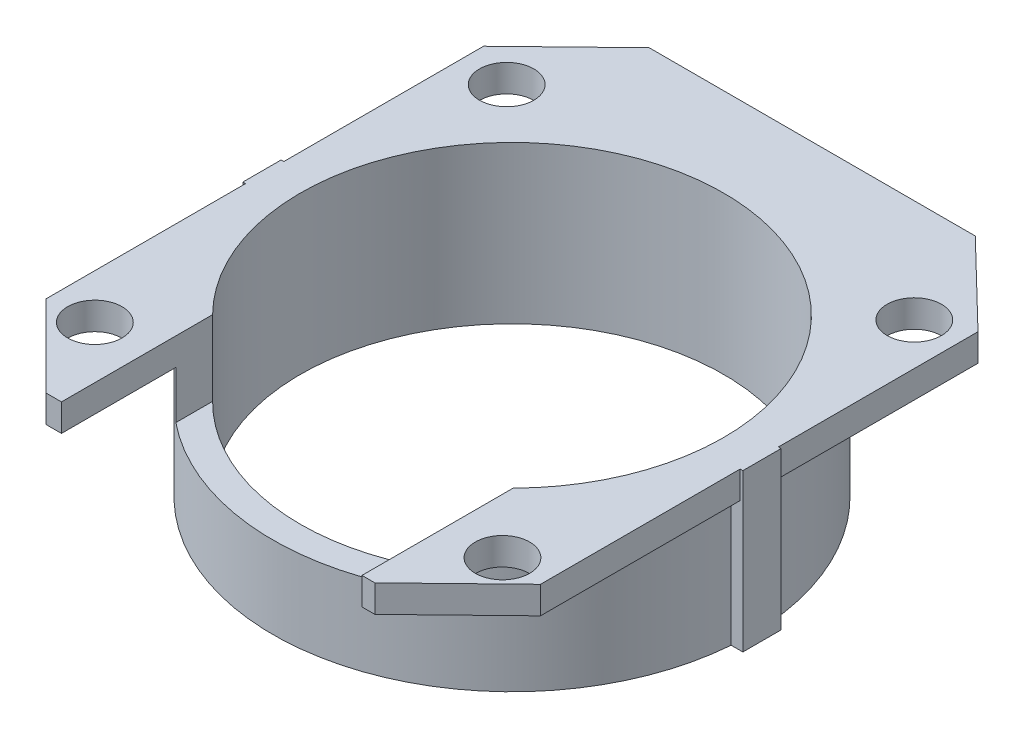
ISO-10303-21;
HEADER;
FILE_DESCRIPTION(('STEP AP214'),'2;1');
FILE_NAME('part.step','',(''),(''),'','','');
FILE_SCHEMA(('AUTOMOTIVE_DESIGN { 1 0 10303 214 1 1 1 1 }'));
ENDSEC;
DATA;
#1=APPLICATION_CONTEXT('core data for automotive mechanical design processes');
#2=APPLICATION_PROTOCOL_DEFINITION('international standard','automotive_design',2000,#1);
#3=PRODUCT_CONTEXT('',#1,'mechanical');
#4=PRODUCT('Part','Part','',(#3));
#5=PRODUCT_RELATED_PRODUCT_CATEGORY('part','',(#4));
#6=PRODUCT_DEFINITION_FORMATION('','',#4);
#7=PRODUCT_DEFINITION_CONTEXT('part definition',#1,'design');
#8=PRODUCT_DEFINITION('design','',#6,#7);
#9=PRODUCT_DEFINITION_SHAPE('','',#8);
#10=(LENGTH_UNIT() NAMED_UNIT(*) SI_UNIT(.MILLI.,.METRE.));
#11=(NAMED_UNIT(*) PLANE_ANGLE_UNIT() SI_UNIT($,.RADIAN.));
#12=(NAMED_UNIT(*) SI_UNIT($,.STERADIAN.) SOLID_ANGLE_UNIT());
#13=UNCERTAINTY_MEASURE_WITH_UNIT(LENGTH_MEASURE(1.E-05),#10,'distance_accuracy_value','');
#14=(GEOMETRIC_REPRESENTATION_CONTEXT(3) GLOBAL_UNCERTAINTY_ASSIGNED_CONTEXT((#13)) GLOBAL_UNIT_ASSIGNED_CONTEXT((#10,
#11,#12)) REPRESENTATION_CONTEXT('',''));
#15=CARTESIAN_POINT('',(0.,0.,0.));
#16=DIRECTION('',(0.,0.,1.));
#17=DIRECTION('',(1.,0.,0.));
#18=AXIS2_PLACEMENT_3D('',#15,#16,#17);
#19=CARTESIAN_POINT('',(0.,2.,21.9847962505184));
#20=DIRECTION('',(0.,0.,-1.));
#21=DIRECTION('',(-1.,0.,0.));
#22=AXIS2_PLACEMENT_3D('',#19,#20,#21);
#23=PLANE('',#22);
#24=DIRECTION('',(0.,-1.,0.));
#25=VECTOR('',#24,1.);
#26=CARTESIAN_POINT('',(11.,0.,21.9847962505184));
#27=LINE('',#26,#25);
#28=CARTESIAN_POINT('',(11.,2.,21.9847962505184));
#29=VERTEX_POINT('',#28);
#30=CARTESIAN_POINT('',(11.,0.,21.9847962505184));
#31=VERTEX_POINT('',#30);
#32=EDGE_CURVE('E230',#29,#31,#27,.T.);
#33=ORIENTED_EDGE('',*,*,#32,.T.);
#34=DIRECTION('',(1.,0.,0.));
#35=VECTOR('',#34,1.);
#36=CARTESIAN_POINT('',(0.,0.,21.9847962505184));
#37=LINE('',#36,#35);
#38=CARTESIAN_POINT('',(11.9425722518396,0.,21.9847962505184));
#39=VERTEX_POINT('',#38);
#40=EDGE_CURVE('E330',#31,#39,#37,.T.);
#41=ORIENTED_EDGE('',*,*,#40,.T.);
#42=DIRECTION('',(0.,-1.,0.));
#43=VECTOR('',#42,1.);
#44=CARTESIAN_POINT('',(11.9425722518396,2.,21.9847962505184));
#45=LINE('',#44,#43);
#46=CARTESIAN_POINT('',(11.9425722518396,2.,21.9847962505184));
#47=VERTEX_POINT('',#46);
#48=EDGE_CURVE('E258',#47,#39,#45,.T.);
#49=ORIENTED_EDGE('',*,*,#48,.F.);
#50=DIRECTION('',(1.,0.,0.));
#51=VECTOR('',#50,1.);
#52=CARTESIAN_POINT('',(0.,2.,21.9847962505184));
#53=LINE('',#52,#51);
#54=EDGE_CURVE('E250',#29,#47,#53,.T.);
#55=ORIENTED_EDGE('',*,*,#54,.F.);
#56=EDGE_LOOP('',(#33,#41,#49,#55));
#57=FACE_BOUND('',#56,.T.);
#58=ADVANCED_FACE('F55',(#57),#23,.F.);
#59=CARTESIAN_POINT('',(0.,0.,0.));
#60=DIRECTION('',(0.,1.,0.));
#61=DIRECTION('',(0.,0.,1.));
#62=AXIS2_PLACEMENT_3D('',#59,#60,#61);
#63=PLANE('',#62);
#64=CARTESIAN_POINT('',(15.0205835199878,0.,15.7176371383797));
#65=DIRECTION('',(0.,1.,0.));
#66=DIRECTION('',(0.,0.,1.));
#67=AXIS2_PLACEMENT_3D('',#64,#65,#66);
#68=CIRCLE('',#67,1.98957432131388);
#69=CARTESIAN_POINT('',(15.0205835199878,0.,17.7072114596936));
#70=VERTEX_POINT('',#69);
#71=EDGE_CURVE('E351',#70,#70,#68,.T.);
#72=ORIENTED_EDGE('',*,*,#71,.T.);
#73=EDGE_LOOP('',(#72));
#74=FACE_BOUND('',#73,.T.);
#75=DIRECTION('',(0.,0.,1.));
#76=VECTOR('',#75,1.);
#77=CARTESIAN_POINT('',(11.,0.,0.));
#78=LINE('',#77,#76);
#79=CARTESIAN_POINT('',(11.,0.,13.6106575888162));
#80=VERTEX_POINT('',#79);
#81=EDGE_CURVE('E236',#80,#31,#78,.T.);
#82=ORIENTED_EDGE('',*,*,#81,.F.);
#83=CARTESIAN_POINT('',(0.,0.,0.));
#84=DIRECTION('',(0.,1.,0.));
#85=DIRECTION('',(0.,0.,1.));
#86=AXIS2_PLACEMENT_3D('',#83,#84,#85);
#87=CIRCLE('',#86,17.5);
#88=CARTESIAN_POINT('',(17.443910112128,0.,1.4));
#89=VERTEX_POINT('',#88);
#90=EDGE_CURVE('E513',#80,#89,#87,.T.);
#91=ORIENTED_EDGE('',*,*,#90,.T.);
#92=DIRECTION('',(1.,0.,0.));
#93=VECTOR('',#92,1.);
#94=CARTESIAN_POINT('',(0.,0.,1.4));
#95=LINE('',#94,#93);
#96=CARTESIAN_POINT('',(18.1,0.,1.4));
#97=VERTEX_POINT('',#96);
#98=EDGE_CURVE('E461',#89,#97,#95,.T.);
#99=ORIENTED_EDGE('',*,*,#98,.T.);
#100=DIRECTION('',(0.,0.,-1.));
#101=VECTOR('',#100,1.);
#102=CARTESIAN_POINT('',(18.1,0.,0.));
#103=LINE('',#102,#101);
#104=CARTESIAN_POINT('',(18.1,0.,16.0160732865767));
#105=VERTEX_POINT('',#104);
#106=EDGE_CURVE('E339',#105,#97,#103,.T.);
#107=ORIENTED_EDGE('',*,*,#106,.F.);
#108=DIRECTION('',(-0.71802370198198,0.,0.696018651612221));
#109=VECTOR('',#108,1.);
#110=CARTESIAN_POINT('',(16.7725585112296,0.,17.3028330865078));
#111=LINE('',#110,#109);
#112=EDGE_CURVE('E335',#105,#39,#111,.T.);
#113=ORIENTED_EDGE('',*,*,#112,.T.);
#114=ORIENTED_EDGE('',*,*,#40,.F.);
#115=EDGE_LOOP('',(#82,#91,#99,#107,#113,#114));
#116=FACE_BOUND('',#115,.T.);
#117=ADVANCED_FACE('F560',(#74,#116),#63,.F.);
#118=CARTESIAN_POINT('',(-14.8230312997206,0.,-14.4323628616201));
#119=DIRECTION('',(0.,1.,0.));
#120=DIRECTION('',(0.,0.,1.));
#121=AXIS2_PLACEMENT_3D('',#118,#119,#120);
#122=CIRCLE('',#121,1.98957432131388);
#123=CARTESIAN_POINT('',(-14.8230312997206,0.,-12.4427885403062));
#124=VERTEX_POINT('',#123);
#125=EDGE_CURVE('E363',#124,#124,#122,.T.);
#126=ORIENTED_EDGE('',*,*,#125,.T.);
#127=EDGE_LOOP('',(#126));
#128=FACE_BOUND('',#127,.T.);
#129=CARTESIAN_POINT('',(15.0205835199876,0.,-14.4323628616203));
#130=DIRECTION('',(0.,1.,0.));
#131=DIRECTION('',(0.,0.,1.));
#132=AXIS2_PLACEMENT_3D('',#129,#130,#131);
#133=CIRCLE('',#132,1.98957432131388);
#134=CARTESIAN_POINT('',(15.0205835199876,0.,-12.4427885403064));
#135=VERTEX_POINT('',#134);
#136=EDGE_CURVE('E359',#135,#135,#133,.T.);
#137=ORIENTED_EDGE('',*,*,#136,.T.);
#138=EDGE_LOOP('',(#137));
#139=FACE_BOUND('',#138,.T.);
#140=DIRECTION('',(1.,0.,0.));
#141=VECTOR('',#140,1.);
#142=CARTESIAN_POINT('',(0.,0.,-1.4));
#143=LINE('',#142,#141);
#144=CARTESIAN_POINT('',(-18.1,0.,-1.4));
#145=VERTEX_POINT('',#144);
#146=CARTESIAN_POINT('',(-17.443910112128,0.,-1.4));
#147=VERTEX_POINT('',#146);
#148=EDGE_CURVE('E451',#145,#147,#143,.T.);
#149=ORIENTED_EDGE('',*,*,#148,.F.);
#150=DIRECTION('',(0.,0.,-1.));
#151=VECTOR('',#150,1.);
#152=CARTESIAN_POINT('',(-18.1,0.,0.));
#153=LINE('',#152,#151);
#154=CARTESIAN_POINT('',(-18.1,0.,-16.0167543599621));
#155=VERTEX_POINT('',#154);
#156=EDGE_CURVE('E320',#145,#155,#153,.T.);
#157=ORIENTED_EDGE('',*,*,#156,.T.);
#158=DIRECTION('',(-0.718023701981979,0.,0.696018651612221));
#159=VECTOR('',#158,1.);
#160=CARTESIAN_POINT('',(-16.7728988830269,0.,-17.3031842193651));
#161=LINE('',#160,#159);
#162=CARTESIAN_POINT('',(-11.9432748577717,0.,-21.9847962505184));
#163=VERTEX_POINT('',#162);
#164=EDGE_CURVE('E315',#163,#155,#161,.T.);
#165=ORIENTED_EDGE('',*,*,#164,.F.);
#166=DIRECTION('',(1.,0.,0.));
#167=VECTOR('',#166,1.);
#168=CARTESIAN_POINT('',(0.,0.,-21.9847962505184));
#169=LINE('',#168,#167);
#170=CARTESIAN_POINT('',(11.9323196039269,0.,-21.9847962505184));
#171=VERTEX_POINT('',#170);
#172=EDGE_CURVE('E311',#163,#171,#169,.T.);
#173=ORIENTED_EDGE('',*,*,#172,.T.);
#174=DIRECTION('',(0.718602141766592,0.,0.695421427516055));
#175=VECTOR('',#174,1.);
#176=CARTESIAN_POINT('',(16.7570919701861,0.,-17.3156617025257));
#177=LINE('',#176,#175);
#178=CARTESIAN_POINT('',(18.1,0.,-16.0160732865768));
#179=VERTEX_POINT('',#178);
#180=EDGE_CURVE('E347',#171,#179,#177,.T.);
#181=ORIENTED_EDGE('',*,*,#180,.T.);
#182=DIRECTION('',(0.,0.,-1.));
#183=VECTOR('',#182,1.);
#184=CARTESIAN_POINT('',(18.1,0.,0.));
#185=LINE('',#184,#183);
#186=CARTESIAN_POINT('',(18.1,0.,-1.4));
#187=VERTEX_POINT('',#186);
#188=EDGE_CURVE('E343',#187,#179,#185,.T.);
#189=ORIENTED_EDGE('',*,*,#188,.F.);
#190=DIRECTION('',(1.,0.,0.));
#191=VECTOR('',#190,1.);
#192=CARTESIAN_POINT('',(0.,0.,-1.4));
#193=LINE('',#192,#191);
#194=CARTESIAN_POINT('',(17.443910112128,0.,-1.4));
#195=VERTEX_POINT('',#194);
#196=EDGE_CURVE('E489',#195,#187,#193,.T.);
#197=ORIENTED_EDGE('',*,*,#196,.F.);
#198=EDGE_CURVE('E316',#195,#147,#87,.T.);
#199=ORIENTED_EDGE('',*,*,#198,.T.);
#200=EDGE_LOOP('',(#149,#157,#165,#173,#181,#189,#197,#199));
#201=FACE_BOUND('',#200,.T.);
#202=ADVANCED_FACE('F645',(#128,#139,#201),#63,.F.);
#203=CARTESIAN_POINT('',(0.,-9.5,0.));
#204=DIRECTION('',(0.,1.,0.));
#205=DIRECTION('',(0.,0.,1.));
#206=AXIS2_PLACEMENT_3D('',#203,#204,#205);
#207=CYLINDRICAL_SURFACE('',#206,17.5);
#208=CARTESIAN_POINT('',(0.,-9.5,0.));
#209=DIRECTION('',(0.,1.,0.));
#210=DIRECTION('',(0.,0.,1.));
#211=AXIS2_PLACEMENT_3D('',#208,#209,#210);
#212=CIRCLE('',#211,17.5);
#213=CARTESIAN_POINT('',(17.443910112128,-9.5,-1.4));
#214=VERTEX_POINT('',#213);
#215=CARTESIAN_POINT('',(-17.443910112128,-9.5,-1.4));
#216=VERTEX_POINT('',#215);
#217=EDGE_CURVE('E510',#214,#216,#212,.T.);
#218=ORIENTED_EDGE('',*,*,#217,.T.);
#219=DIRECTION('',(0.,1.,0.));
#220=VECTOR('',#219,1.);
#221=CARTESIAN_POINT('',(-17.443910112128,-12.4279497769116,-1.4));
#222=LINE('',#221,#220);
#223=EDGE_CURVE('E468',#216,#147,#222,.T.);
#224=ORIENTED_EDGE('',*,*,#223,.T.);
#225=ORIENTED_EDGE('',*,*,#198,.F.);
#226=DIRECTION('',(0.,1.,0.));
#227=VECTOR('',#226,1.);
#228=CARTESIAN_POINT('',(17.443910112128,-12.4279497769116,-1.4));
#229=LINE('',#228,#227);
#230=EDGE_CURVE('E493',#214,#195,#229,.T.);
#231=ORIENTED_EDGE('',*,*,#230,.F.);
#232=EDGE_LOOP('',(#218,#224,#225,#231));
#233=FACE_BOUND('',#232,.T.);
#234=ADVANCED_FACE('F683',(#233),#207,.T.);
#235=CARTESIAN_POINT('',(0.,2.,-21.9847962505184));
#236=DIRECTION('',(0.,0.,-1.));
#237=DIRECTION('',(-1.,0.,0.));
#238=AXIS2_PLACEMENT_3D('',#235,#236,#237);
#239=PLANE('',#238);
#240=ORIENTED_EDGE('',*,*,#172,.F.);
#241=DIRECTION('',(0.,-1.,0.));
#242=VECTOR('',#241,1.);
#243=CARTESIAN_POINT('',(-11.9432748577717,2.,-21.9847962505184));
#244=LINE('',#243,#242);
#245=CARTESIAN_POINT('',(-11.9432748577717,2.,-21.9847962505184));
#246=VERTEX_POINT('',#245);
#247=EDGE_CURVE('E414',#246,#163,#244,.T.);
#248=ORIENTED_EDGE('',*,*,#247,.F.);
#249=DIRECTION('',(1.,0.,0.));
#250=VECTOR('',#249,1.);
#251=CARTESIAN_POINT('',(0.,2.,-21.9847962505184));
#252=LINE('',#251,#250);
#253=CARTESIAN_POINT('',(11.9323196039269,2.,-21.9847962505184));
#254=VERTEX_POINT('',#253);
#255=EDGE_CURVE('E367',#246,#254,#252,.T.);
#256=ORIENTED_EDGE('',*,*,#255,.T.);
#257=DIRECTION('',(0.,-1.,0.));
#258=VECTOR('',#257,1.);
#259=CARTESIAN_POINT('',(11.9323196039269,2.,-21.9847962505184));
#260=LINE('',#259,#258);
#261=EDGE_CURVE('E310',#254,#171,#260,.T.);
#262=ORIENTED_EDGE('',*,*,#261,.T.);
#263=EDGE_LOOP('',(#240,#248,#256,#262));
#264=FACE_BOUND('',#263,.T.);
#265=ADVANCED_FACE('F57',(#264),#239,.T.);
#266=CARTESIAN_POINT('',(-16.7728988830269,2.,-17.3031842193651));
#267=DIRECTION('',(0.696018651612221,0.,0.718023701981979));
#268=DIRECTION('',(0.718023701981979,0.,-0.696018651612221));
#269=AXIS2_PLACEMENT_3D('',#266,#267,#268);
#270=PLANE('',#269);
#271=ORIENTED_EDGE('',*,*,#164,.T.);
#272=DIRECTION('',(0.,-1.,0.));
#273=VECTOR('',#272,1.);
#274=CARTESIAN_POINT('',(-18.1,2.,-16.0167543599621));
#275=LINE('',#274,#273);
#276=CARTESIAN_POINT('',(-18.1,2.,-16.0167543599621));
#277=VERTEX_POINT('',#276);
#278=EDGE_CURVE('E411',#277,#155,#275,.T.);
#279=ORIENTED_EDGE('',*,*,#278,.F.);
#280=DIRECTION('',(-0.718023701981979,0.,0.696018651612221));
#281=VECTOR('',#280,1.);
#282=CARTESIAN_POINT('',(-16.7728988830269,2.,-17.3031842193651));
#283=LINE('',#282,#281);
#284=EDGE_CURVE('E521',#246,#277,#283,.T.);
#285=ORIENTED_EDGE('',*,*,#284,.F.);
#286=ORIENTED_EDGE('',*,*,#247,.T.);
#287=EDGE_LOOP('',(#271,#279,#285,#286));
#288=FACE_BOUND('',#287,.T.);
#289=ADVANCED_FACE('F601',(#288),#270,.F.);
#290=CARTESIAN_POINT('',(-18.1,2.,0.));
#291=DIRECTION('',(-1.,0.,0.));
#292=DIRECTION('',(0.,0.,1.));
#293=AXIS2_PLACEMENT_3D('',#290,#291,#292);
#294=PLANE('',#293);
#295=ORIENTED_EDGE('',*,*,#156,.F.);
#296=DIRECTION('',(0.,-1.,0.));
#297=VECTOR('',#296,1.);
#298=CARTESIAN_POINT('',(-18.1,2.,-1.4));
#299=LINE('',#298,#297);
#300=CARTESIAN_POINT('',(-18.1,2.,-1.4));
#301=VERTEX_POINT('',#300);
#302=EDGE_CURVE('E407',#301,#145,#299,.T.);
#303=ORIENTED_EDGE('',*,*,#302,.F.);
#304=DIRECTION('',(0.,0.,-1.));
#305=VECTOR('',#304,1.);
#306=CARTESIAN_POINT('',(-18.1,2.,0.));
#307=LINE('',#306,#305);
#308=EDGE_CURVE('E524',#301,#277,#307,.T.);
#309=ORIENTED_EDGE('',*,*,#308,.T.);
#310=ORIENTED_EDGE('',*,*,#278,.T.);
#311=EDGE_LOOP('',(#295,#303,#309,#310));
#312=FACE_BOUND('',#311,.T.);
#313=ADVANCED_FACE('F605',(#312),#294,.T.);
#314=CARTESIAN_POINT('',(0.,2.,-1.4));
#315=DIRECTION('',(0.,0.,-1.));
#316=DIRECTION('',(-1.,0.,0.));
#317=AXIS2_PLACEMENT_3D('',#314,#315,#316);
#318=PLANE('',#317);
#319=ORIENTED_EDGE('',*,*,#302,.T.);
#320=ORIENTED_EDGE('',*,*,#148,.T.);
#321=ORIENTED_EDGE('',*,*,#223,.F.);
#322=DIRECTION('',(-1.,0.,0.));
#323=VECTOR('',#322,1.);
#324=CARTESIAN_POINT('',(0.,-9.5,-1.4));
#325=LINE('',#324,#323);
#326=CARTESIAN_POINT('',(-18.3,-9.5,-1.4));
#327=VERTEX_POINT('',#326);
#328=EDGE_CURVE('E456',#216,#327,#325,.T.);
#329=ORIENTED_EDGE('',*,*,#328,.T.);
#330=DIRECTION('',(0.,-1.,0.));
#331=VECTOR('',#330,1.);
#332=CARTESIAN_POINT('',(-18.3,2.,-1.4));
#333=LINE('',#332,#331);
#334=CARTESIAN_POINT('',(-18.3,2.,-1.4));
#335=VERTEX_POINT('',#334);
#336=EDGE_CURVE('E404',#335,#327,#333,.T.);
#337=ORIENTED_EDGE('',*,*,#336,.F.);
#338=DIRECTION('',(1.,0.,0.));
#339=VECTOR('',#338,1.);
#340=CARTESIAN_POINT('',(0.,2.,-1.4));
#341=LINE('',#340,#339);
#342=EDGE_CURVE('E528',#335,#301,#341,.T.);
#343=ORIENTED_EDGE('',*,*,#342,.T.);
#344=EDGE_LOOP('',(#319,#320,#321,#329,#337,#343));
#345=FACE_BOUND('',#344,.T.);
#346=ADVANCED_FACE('F607',(#345),#318,.T.);
#347=CARTESIAN_POINT('',(-18.3,2.,0.));
#348=DIRECTION('',(-1.,0.,0.));
#349=DIRECTION('',(0.,0.,1.));
#350=AXIS2_PLACEMENT_3D('',#347,#348,#349);
#351=PLANE('',#350);
#352=ORIENTED_EDGE('',*,*,#336,.T.);
#353=DIRECTION('',(0.,0.,1.));
#354=VECTOR('',#353,1.);
#355=CARTESIAN_POINT('',(-18.3,-9.5,0.));
#356=LINE('',#355,#354);
#357=CARTESIAN_POINT('',(-18.3,-9.5,1.4));
#358=VERTEX_POINT('',#357);
#359=EDGE_CURVE('E457',#327,#358,#356,.T.);
#360=ORIENTED_EDGE('',*,*,#359,.T.);
#361=DIRECTION('',(0.,-1.,0.));
#362=VECTOR('',#361,1.);
#363=CARTESIAN_POINT('',(-18.3,2.,1.4));
#364=LINE('',#363,#362);
#365=CARTESIAN_POINT('',(-18.3,2.,1.4));
#366=VERTEX_POINT('',#365);
#367=EDGE_CURVE('E401',#366,#358,#364,.T.);
#368=ORIENTED_EDGE('',*,*,#367,.F.);
#369=DIRECTION('',(0.,0.,-1.));
#370=VECTOR('',#369,1.);
#371=CARTESIAN_POINT('',(-18.3,2.,0.));
#372=LINE('',#371,#370);
#373=EDGE_CURVE('E532',#366,#335,#372,.T.);
#374=ORIENTED_EDGE('',*,*,#373,.T.);
#375=EDGE_LOOP('',(#352,#360,#368,#374));
#376=FACE_BOUND('',#375,.T.);
#377=ADVANCED_FACE('F610',(#376),#351,.T.);
#378=CARTESIAN_POINT('',(0.,2.,1.4));
#379=DIRECTION('',(0.,0.,-1.));
#380=DIRECTION('',(-1.,0.,0.));
#381=AXIS2_PLACEMENT_3D('',#378,#379,#380);
#382=PLANE('',#381);
#383=ORIENTED_EDGE('',*,*,#367,.T.);
#384=DIRECTION('',(-1.,0.,0.));
#385=VECTOR('',#384,1.);
#386=CARTESIAN_POINT('',(0.,-9.5,1.4));
#387=LINE('',#386,#385);
#388=CARTESIAN_POINT('',(-17.443910112128,-9.5,1.4));
#389=VERTEX_POINT('',#388);
#390=EDGE_CURVE('E452',#389,#358,#387,.T.);
#391=ORIENTED_EDGE('',*,*,#390,.F.);
#392=DIRECTION('',(0.,1.,0.));
#393=VECTOR('',#392,1.);
#394=CARTESIAN_POINT('',(-17.443910112128,-12.4279497769116,1.4));
#395=LINE('',#394,#393);
#396=CARTESIAN_POINT('',(-17.443910112128,0.,1.4));
#397=VERTEX_POINT('',#396);
#398=EDGE_CURVE('E467',#389,#397,#395,.T.);
#399=ORIENTED_EDGE('',*,*,#398,.T.);
#400=DIRECTION('',(1.,0.,0.));
#401=VECTOR('',#400,1.);
#402=CARTESIAN_POINT('',(0.,0.,1.4));
#403=LINE('',#402,#401);
#404=CARTESIAN_POINT('',(-18.1,0.,1.4));
#405=VERTEX_POINT('',#404);
#406=EDGE_CURVE('E79',#405,#397,#403,.T.);
#407=ORIENTED_EDGE('',*,*,#406,.F.);
#408=DIRECTION('',(0.,-1.,0.));
#409=VECTOR('',#408,1.);
#410=CARTESIAN_POINT('',(-18.1,2.,1.4));
#411=LINE('',#410,#409);
#412=CARTESIAN_POINT('',(-18.1,2.,1.4));
#413=VERTEX_POINT('',#412);
#414=EDGE_CURVE('E398',#413,#405,#411,.T.);
#415=ORIENTED_EDGE('',*,*,#414,.F.);
#416=DIRECTION('',(1.,0.,0.));
#417=VECTOR('',#416,1.);
#418=CARTESIAN_POINT('',(0.,2.,1.4));
#419=LINE('',#418,#417);
#420=EDGE_CURVE('E536',#366,#413,#419,.T.);
#421=ORIENTED_EDGE('',*,*,#420,.F.);
#422=EDGE_LOOP('',(#383,#391,#399,#407,#415,#421));
#423=FACE_BOUND('',#422,.T.);
#424=ADVANCED_FACE('F551',(#423),#382,.F.);
#425=CARTESIAN_POINT('',(-18.1,2.,0.));
#426=DIRECTION('',(-1.,0.,0.));
#427=DIRECTION('',(0.,0.,1.));
#428=AXIS2_PLACEMENT_3D('',#425,#426,#427);
#429=PLANE('',#428);
#430=DIRECTION('',(0.,0.,-1.));
#431=VECTOR('',#430,1.);
#432=CARTESIAN_POINT('',(-18.1,0.,0.));
#433=LINE('',#432,#431);
#434=CARTESIAN_POINT('',(-18.1,0.,16.0167758925088));
#435=VERTEX_POINT('',#434);
#436=EDGE_CURVE('E324',#435,#405,#433,.T.);
#437=ORIENTED_EDGE('',*,*,#436,.F.);
#438=DIRECTION('',(0.,-1.,0.));
#439=VECTOR('',#438,1.);
#440=CARTESIAN_POINT('',(-18.1,2.,16.0167758925088));
#441=LINE('',#440,#439);
#442=CARTESIAN_POINT('',(-18.1,2.,16.0167758925088));
#443=VERTEX_POINT('',#442);
#444=EDGE_CURVE('E395',#443,#435,#441,.T.);
#445=ORIENTED_EDGE('',*,*,#444,.F.);
#446=DIRECTION('',(0.,0.,-1.));
#447=VECTOR('',#446,1.);
#448=CARTESIAN_POINT('',(-18.1,2.,0.));
#449=LINE('',#448,#447);
#450=EDGE_CURVE('E268',#443,#413,#449,.T.);
#451=ORIENTED_EDGE('',*,*,#450,.T.);
#452=ORIENTED_EDGE('',*,*,#414,.T.);
#453=EDGE_LOOP('',(#437,#445,#451,#452));
#454=FACE_BOUND('',#453,.T.);
#455=ADVANCED_FACE('F543',(#454),#429,.T.);
#456=CARTESIAN_POINT('',(-17.0583879462544,2.,17.0583879462544));
#457=DIRECTION('',(0.707106781186547,0.,-0.707106781186547));
#458=DIRECTION('',(-0.707106781186548,0.,-0.707106781186548));
#459=AXIS2_PLACEMENT_3D('',#456,#457,#458);
#460=PLANE('',#459);
#461=DIRECTION('',(0.707106781186548,0.,0.707106781186548));
#462=VECTOR('',#461,1.);
#463=CARTESIAN_POINT('',(-17.0583879462544,0.,17.0583879462544));
#464=LINE('',#463,#462);
#465=CARTESIAN_POINT('',(-12.1319796419904,0.,21.9847962505184));
#466=VERTEX_POINT('',#465);
#467=EDGE_CURVE('E327',#435,#466,#464,.T.);
#468=ORIENTED_EDGE('',*,*,#467,.T.);
#469=DIRECTION('',(0.,-1.,0.));
#470=VECTOR('',#469,1.);
#471=CARTESIAN_POINT('',(-12.1319796419904,2.,21.9847962505184));
#472=LINE('',#471,#470);
#473=CARTESIAN_POINT('',(-12.1319796419904,2.,21.9847962505184));
#474=VERTEX_POINT('',#473);
#475=EDGE_CURVE('E391',#474,#466,#472,.T.);
#476=ORIENTED_EDGE('',*,*,#475,.F.);
#477=DIRECTION('',(0.707106781186548,0.,0.707106781186548));
#478=VECTOR('',#477,1.);
#479=CARTESIAN_POINT('',(-17.0583879462544,2.,17.0583879462544));
#480=LINE('',#479,#478);
#481=EDGE_CURVE('E262',#443,#474,#480,.T.);
#482=ORIENTED_EDGE('',*,*,#481,.F.);
#483=ORIENTED_EDGE('',*,*,#444,.T.);
#484=EDGE_LOOP('',(#468,#476,#482,#483));
#485=FACE_BOUND('',#484,.T.);
#486=ADVANCED_FACE('F629',(#485),#460,.F.);
#487=CARTESIAN_POINT('',(-11.,0.,21.9847962505184));
#488=VERTEX_POINT('',#487);
#489=EDGE_CURVE('E331',#466,#488,#37,.T.);
#490=ORIENTED_EDGE('',*,*,#489,.T.);
#491=DIRECTION('',(0.,-1.,0.));
#492=VECTOR('',#491,1.);
#493=CARTESIAN_POINT('',(-11.,0.,21.9847962505184));
#494=LINE('',#493,#492);
#495=CARTESIAN_POINT('',(-11.,2.,21.9847962505184));
#496=VERTEX_POINT('',#495);
#497=EDGE_CURVE('E242',#496,#488,#494,.T.);
#498=ORIENTED_EDGE('',*,*,#497,.F.);
#499=EDGE_CURVE('E261',#474,#496,#53,.T.);
#500=ORIENTED_EDGE('',*,*,#499,.F.);
#501=ORIENTED_EDGE('',*,*,#475,.T.);
#502=EDGE_LOOP('',(#490,#498,#500,#501));
#503=FACE_BOUND('',#502,.T.);
#504=ADVANCED_FACE('F627',(#503),#23,.F.);
#505=CARTESIAN_POINT('',(16.7725585112296,2.,17.3028330865078));
#506=DIRECTION('',(0.696018651612221,0.,0.71802370198198));
#507=DIRECTION('',(0.71802370198198,0.,-0.696018651612221));
#508=AXIS2_PLACEMENT_3D('',#505,#506,#507);
#509=PLANE('',#508);
#510=ORIENTED_EDGE('',*,*,#112,.F.);
#511=DIRECTION('',(0.,-1.,0.));
#512=VECTOR('',#511,1.);
#513=CARTESIAN_POINT('',(18.1,2.,16.0160732865767));
#514=LINE('',#513,#512);
#515=CARTESIAN_POINT('',(18.1,2.,16.0160732865767));
#516=VERTEX_POINT('',#515);
#517=EDGE_CURVE('E386',#516,#105,#514,.T.);
#518=ORIENTED_EDGE('',*,*,#517,.F.);
#519=DIRECTION('',(-0.71802370198198,0.,0.696018651612221));
#520=VECTOR('',#519,1.);
#521=CARTESIAN_POINT('',(16.7725585112296,2.,17.3028330865078));
#522=LINE('',#521,#520);
#523=EDGE_CURVE('E267',#516,#47,#522,.T.);
#524=ORIENTED_EDGE('',*,*,#523,.T.);
#525=ORIENTED_EDGE('',*,*,#48,.T.);
#526=EDGE_LOOP('',(#510,#518,#524,#525));
#527=FACE_BOUND('',#526,.T.);
#528=ADVANCED_FACE('F575',(#527),#509,.T.);
#529=CARTESIAN_POINT('',(18.1,2.,0.));
#530=DIRECTION('',(-1.,0.,0.));
#531=DIRECTION('',(0.,0.,1.));
#532=AXIS2_PLACEMENT_3D('',#529,#530,#531);
#533=PLANE('',#532);
#534=ORIENTED_EDGE('',*,*,#106,.T.);
#535=DIRECTION('',(0.,-1.,0.));
#536=VECTOR('',#535,1.);
#537=CARTESIAN_POINT('',(18.1,2.,1.4));
#538=LINE('',#537,#536);
#539=CARTESIAN_POINT('',(18.1,2.,1.4));
#540=VERTEX_POINT('',#539);
#541=EDGE_CURVE('E382',#540,#97,#538,.T.);
#542=ORIENTED_EDGE('',*,*,#541,.F.);
#543=DIRECTION('',(0.,0.,-1.));
#544=VECTOR('',#543,1.);
#545=CARTESIAN_POINT('',(18.1,2.,0.));
#546=LINE('',#545,#544);
#547=EDGE_CURVE('E274',#516,#540,#546,.T.);
#548=ORIENTED_EDGE('',*,*,#547,.F.);
#549=ORIENTED_EDGE('',*,*,#517,.T.);
#550=EDGE_LOOP('',(#534,#542,#548,#549));
#551=FACE_BOUND('',#550,.T.);
#552=ADVANCED_FACE('F572',(#551),#533,.F.);
#553=CARTESIAN_POINT('',(0.,2.,1.4));
#554=DIRECTION('',(0.,0.,-1.));
#555=DIRECTION('',(-1.,0.,0.));
#556=AXIS2_PLACEMENT_3D('',#553,#554,#555);
#557=PLANE('',#556);
#558=ORIENTED_EDGE('',*,*,#541,.T.);
#559=ORIENTED_EDGE('',*,*,#98,.F.);
#560=DIRECTION('',(0.,1.,0.));
#561=VECTOR('',#560,1.);
#562=CARTESIAN_POINT('',(17.443910112128,-12.4279497769116,1.4));
#563=LINE('',#562,#561);
#564=CARTESIAN_POINT('',(17.443910112128,-9.5,1.4));
#565=VERTEX_POINT('',#564);
#566=EDGE_CURVE('E482',#565,#89,#563,.T.);
#567=ORIENTED_EDGE('',*,*,#566,.F.);
#568=DIRECTION('',(-1.,0.,0.));
#569=VECTOR('',#568,1.);
#570=CARTESIAN_POINT('',(0.,-9.5,1.4));
#571=LINE('',#570,#569);
#572=CARTESIAN_POINT('',(18.3,-9.5,1.4));
#573=VERTEX_POINT('',#572);
#574=EDGE_CURVE('E481',#573,#565,#571,.T.);
#575=ORIENTED_EDGE('',*,*,#574,.F.);
#576=DIRECTION('',(0.,-1.,0.));
#577=VECTOR('',#576,1.);
#578=CARTESIAN_POINT('',(18.3,2.,1.4));
#579=LINE('',#578,#577);
#580=CARTESIAN_POINT('',(18.3,2.,1.4));
#581=VERTEX_POINT('',#580);
#582=EDGE_CURVE('E379',#581,#573,#579,.T.);
#583=ORIENTED_EDGE('',*,*,#582,.F.);
#584=DIRECTION('',(1.,0.,0.));
#585=VECTOR('',#584,1.);
#586=CARTESIAN_POINT('',(0.,2.,1.4));
#587=LINE('',#586,#585);
#588=EDGE_CURVE('E277',#540,#581,#587,.T.);
#589=ORIENTED_EDGE('',*,*,#588,.F.);
#590=EDGE_LOOP('',(#558,#559,#567,#575,#583,#589));
#591=FACE_BOUND('',#590,.T.);
#592=ADVANCED_FACE('F566',(#591),#557,.F.);
#593=CARTESIAN_POINT('',(18.3,2.,0.));
#594=DIRECTION('',(-1.,0.,0.));
#595=DIRECTION('',(0.,0.,1.));
#596=AXIS2_PLACEMENT_3D('',#593,#594,#595);
#597=PLANE('',#596);
#598=ORIENTED_EDGE('',*,*,#582,.T.);
#599=DIRECTION('',(0.,0.,1.));
#600=VECTOR('',#599,1.);
#601=CARTESIAN_POINT('',(18.3,-9.5,0.));
#602=LINE('',#601,#600);
#603=CARTESIAN_POINT('',(18.3,-9.5,-1.4));
#604=VERTEX_POINT('',#603);
#605=EDGE_CURVE('E486',#604,#573,#602,.T.);
#606=ORIENTED_EDGE('',*,*,#605,.F.);
#607=DIRECTION('',(0.,-1.,0.));
#608=VECTOR('',#607,1.);
#609=CARTESIAN_POINT('',(18.3,2.,-1.4));
#610=LINE('',#609,#608);
#611=CARTESIAN_POINT('',(18.3,2.,-1.4));
#612=VERTEX_POINT('',#611);
#613=EDGE_CURVE('E376',#612,#604,#610,.T.);
#614=ORIENTED_EDGE('',*,*,#613,.F.);
#615=DIRECTION('',(0.,0.,-1.));
#616=VECTOR('',#615,1.);
#617=CARTESIAN_POINT('',(18.3,2.,0.));
#618=LINE('',#617,#616);
#619=EDGE_CURVE('E280',#581,#612,#618,.T.);
#620=ORIENTED_EDGE('',*,*,#619,.F.);
#621=EDGE_LOOP('',(#598,#606,#614,#620));
#622=FACE_BOUND('',#621,.T.);
#623=ADVANCED_FACE('F581',(#622),#597,.F.);
#624=CARTESIAN_POINT('',(0.,2.,-1.4));
#625=DIRECTION('',(0.,0.,-1.));
#626=DIRECTION('',(-1.,0.,0.));
#627=AXIS2_PLACEMENT_3D('',#624,#625,#626);
#628=PLANE('',#627);
#629=ORIENTED_EDGE('',*,*,#613,.T.);
#630=DIRECTION('',(-1.,0.,0.));
#631=VECTOR('',#630,1.);
#632=CARTESIAN_POINT('',(0.,-9.5,-1.4));
#633=LINE('',#632,#631);
#634=EDGE_CURVE('E477',#604,#214,#633,.T.);
#635=ORIENTED_EDGE('',*,*,#634,.T.);
#636=ORIENTED_EDGE('',*,*,#230,.T.);
#637=ORIENTED_EDGE('',*,*,#196,.T.);
#638=DIRECTION('',(0.,-1.,0.));
#639=VECTOR('',#638,1.);
#640=CARTESIAN_POINT('',(18.1,2.,-1.4));
#641=LINE('',#640,#639);
#642=CARTESIAN_POINT('',(18.1,2.,-1.4));
#643=VERTEX_POINT('',#642);
#644=EDGE_CURVE('E373',#643,#187,#641,.T.);
#645=ORIENTED_EDGE('',*,*,#644,.F.);
#646=DIRECTION('',(1.,0.,0.));
#647=VECTOR('',#646,1.);
#648=CARTESIAN_POINT('',(0.,2.,-1.4));
#649=LINE('',#648,#647);
#650=EDGE_CURVE('E283',#643,#612,#649,.T.);
#651=ORIENTED_EDGE('',*,*,#650,.T.);
#652=EDGE_LOOP('',(#629,#635,#636,#637,#645,#651));
#653=FACE_BOUND('',#652,.T.);
#654=ADVANCED_FACE('F584',(#653),#628,.T.);
#655=CARTESIAN_POINT('',(18.1,2.,0.));
#656=DIRECTION('',(-1.,0.,0.));
#657=DIRECTION('',(0.,0.,1.));
#658=AXIS2_PLACEMENT_3D('',#655,#656,#657);
#659=PLANE('',#658);
#660=ORIENTED_EDGE('',*,*,#188,.T.);
#661=DIRECTION('',(0.,-1.,0.));
#662=VECTOR('',#661,1.);
#663=CARTESIAN_POINT('',(18.1,2.,-16.0160732865768));
#664=LINE('',#663,#662);
#665=CARTESIAN_POINT('',(18.1,2.,-16.0160732865768));
#666=VERTEX_POINT('',#665);
#667=EDGE_CURVE('E370',#666,#179,#664,.T.);
#668=ORIENTED_EDGE('',*,*,#667,.F.);
#669=DIRECTION('',(0.,0.,-1.));
#670=VECTOR('',#669,1.);
#671=CARTESIAN_POINT('',(18.1,2.,0.));
#672=LINE('',#671,#670);
#673=EDGE_CURVE('E287',#643,#666,#672,.T.);
#674=ORIENTED_EDGE('',*,*,#673,.F.);
#675=ORIENTED_EDGE('',*,*,#644,.T.);
#676=EDGE_LOOP('',(#660,#668,#674,#675));
#677=FACE_BOUND('',#676,.T.);
#678=ADVANCED_FACE('F590',(#677),#659,.F.);
#679=CARTESIAN_POINT('',(15.0205835199876,2.,-14.4323628616203));
#680=DIRECTION('',(0.,-1.,0.));
#681=DIRECTION('',(0.,0.,-1.));
#682=AXIS2_PLACEMENT_3D('',#679,#680,#681);
#683=CYLINDRICAL_SURFACE('',#682,1.98957432131388);
#684=CARTESIAN_POINT('',(15.0205835199876,2.,-14.4323628616203));
#685=DIRECTION('',(0.,1.,0.));
#686=DIRECTION('',(0.,0.,1.));
#687=AXIS2_PLACEMENT_3D('',#684,#685,#686);
#688=CIRCLE('',#687,1.98957432131388);
#689=CARTESIAN_POINT('',(15.0205835199876,2.,-12.4427885403064));
#690=VERTEX_POINT('',#689);
#691=EDGE_CURVE('E302',#690,#690,#688,.T.);
#692=ORIENTED_EDGE('',*,*,#691,.T.);
#693=EDGE_LOOP('',(#692));
#694=FACE_BOUND('',#693,.T.);
#695=ORIENTED_EDGE('',*,*,#136,.F.);
#696=EDGE_LOOP('',(#695));
#697=FACE_BOUND('',#696,.T.);
#698=ADVANCED_FACE('F660',(#694,#697),#683,.F.);
#699=CARTESIAN_POINT('',(-14.8230312997205,2.,15.7176371383799));
#700=DIRECTION('',(0.,-1.,0.));
#701=DIRECTION('',(0.,0.,-1.));
#702=AXIS2_PLACEMENT_3D('',#699,#700,#701);
#703=CYLINDRICAL_SURFACE('',#702,1.98957432131388);
#704=CARTESIAN_POINT('',(-14.8230312997205,2.,15.7176371383799));
#705=DIRECTION('',(0.,1.,0.));
#706=DIRECTION('',(0.,0.,1.));
#707=AXIS2_PLACEMENT_3D('',#704,#705,#706);
#708=CIRCLE('',#707,1.98957432131388);
#709=CARTESIAN_POINT('',(-14.8230312997205,2.,17.7072114596938));
#710=VERTEX_POINT('',#709);
#711=EDGE_CURVE('E298',#710,#710,#708,.T.);
#712=ORIENTED_EDGE('',*,*,#711,.T.);
#713=EDGE_LOOP('',(#712));
#714=FACE_BOUND('',#713,.T.);
#715=CARTESIAN_POINT('',(-14.8230312997205,0.,15.7176371383799));
#716=DIRECTION('',(0.,1.,0.));
#717=DIRECTION('',(0.,0.,1.));
#718=AXIS2_PLACEMENT_3D('',#715,#716,#717);
#719=CIRCLE('',#718,1.98957432131388);
#720=CARTESIAN_POINT('',(-14.8230312997205,0.,17.7072114596938));
#721=VERTEX_POINT('',#720);
#722=EDGE_CURVE('E355',#721,#721,#719,.T.);
#723=ORIENTED_EDGE('',*,*,#722,.F.);
#724=EDGE_LOOP('',(#723));
#725=FACE_BOUND('',#724,.T.);
#726=ADVANCED_FACE('F667',(#714,#725),#703,.F.);
#727=CARTESIAN_POINT('',(15.0205835199878,2.,15.7176371383797));
#728=DIRECTION('',(0.,-1.,0.));
#729=DIRECTION('',(0.,0.,-1.));
#730=AXIS2_PLACEMENT_3D('',#727,#728,#729);
#731=CYLINDRICAL_SURFACE('',#730,1.98957432131388);
#732=CARTESIAN_POINT('',(15.0205835199878,2.,15.7176371383797));
#733=DIRECTION('',(0.,1.,0.));
#734=DIRECTION('',(0.,0.,1.));
#735=AXIS2_PLACEMENT_3D('',#732,#733,#734);
#736=CIRCLE('',#735,1.98957432131388);
#737=CARTESIAN_POINT('',(15.0205835199878,2.,17.7072114596936));
#738=VERTEX_POINT('',#737);
#739=EDGE_CURVE('E294',#738,#738,#736,.T.);
#740=ORIENTED_EDGE('',*,*,#739,.T.);
#741=EDGE_LOOP('',(#740));
#742=FACE_BOUND('',#741,.T.);
#743=ORIENTED_EDGE('',*,*,#71,.F.);
#744=EDGE_LOOP('',(#743));
#745=FACE_BOUND('',#744,.T.);
#746=ADVANCED_FACE('F664',(#742,#745),#731,.F.);
#747=CARTESIAN_POINT('',(16.7570919701861,2.,-17.3156617025257));
#748=DIRECTION('',(0.695421427516055,0.,-0.718602141766592));
#749=DIRECTION('',(-0.718602141766592,0.,-0.695421427516055));
#750=AXIS2_PLACEMENT_3D('',#747,#748,#749);
#751=PLANE('',#750);
#752=ORIENTED_EDGE('',*,*,#180,.F.);
#753=ORIENTED_EDGE('',*,*,#261,.F.);
#754=DIRECTION('',(0.718602141766592,0.,0.695421427516055));
#755=VECTOR('',#754,1.);
#756=CARTESIAN_POINT('',(16.7570919701861,2.,-17.3156617025257));
#757=LINE('',#756,#755);
#758=EDGE_CURVE('E290',#254,#666,#757,.T.);
#759=ORIENTED_EDGE('',*,*,#758,.T.);
#760=ORIENTED_EDGE('',*,*,#667,.T.);
#761=EDGE_LOOP('',(#752,#753,#759,#760));
#762=FACE_BOUND('',#761,.T.);
#763=ADVANCED_FACE('F594',(#762),#751,.T.);
#764=CARTESIAN_POINT('',(-14.8230312997206,2.,-14.4323628616201));
#765=DIRECTION('',(0.,-1.,0.));
#766=DIRECTION('',(0.,0.,-1.));
#767=AXIS2_PLACEMENT_3D('',#764,#765,#766);
#768=CYLINDRICAL_SURFACE('',#767,1.98957432131388);
#769=CARTESIAN_POINT('',(-14.8230312997206,2.,-14.4323628616201));
#770=DIRECTION('',(0.,1.,0.));
#771=DIRECTION('',(0.,0.,1.));
#772=AXIS2_PLACEMENT_3D('',#769,#770,#771);
#773=CIRCLE('',#772,1.98957432131388);
#774=CARTESIAN_POINT('',(-14.8230312997206,2.,-12.4427885403062));
#775=VERTEX_POINT('',#774);
#776=EDGE_CURVE('E306',#775,#775,#773,.T.);
#777=ORIENTED_EDGE('',*,*,#776,.T.);
#778=EDGE_LOOP('',(#777));
#779=FACE_BOUND('',#778,.T.);
#780=ORIENTED_EDGE('',*,*,#125,.F.);
#781=EDGE_LOOP('',(#780));
#782=FACE_BOUND('',#781,.T.);
#783=ADVANCED_FACE('F663',(#779,#782),#768,.F.);
#784=CARTESIAN_POINT('',(0.,2.,0.));
#785=DIRECTION('',(0.,1.,0.));
#786=DIRECTION('',(0.,0.,1.));
#787=AXIS2_PLACEMENT_3D('',#784,#785,#786);
#788=PLANE('',#787);
#789=DIRECTION('',(0.,0.,1.));
#790=VECTOR('',#789,1.);
#791=CARTESIAN_POINT('',(-11.,2.,7.98479625051841));
#792=LINE('',#791,#790);
#793=CARTESIAN_POINT('',(-11.,2.,10.9201648339208));
#794=VERTEX_POINT('',#793);
#795=EDGE_CURVE('E255',#794,#496,#792,.T.);
#796=ORIENTED_EDGE('',*,*,#795,.F.);
#797=CARTESIAN_POINT('',(0.,2.,0.));
#798=DIRECTION('',(0.,1.,0.));
#799=DIRECTION('',(0.,0.,1.));
#800=AXIS2_PLACEMENT_3D('',#797,#798,#799);
#801=CIRCLE('',#800,15.5);
#802=CARTESIAN_POINT('',(11.,2.,10.9201648339208));
#803=VERTEX_POINT('',#802);
#804=EDGE_CURVE('E253',#803,#794,#801,.T.);
#805=ORIENTED_EDGE('',*,*,#804,.F.);
#806=DIRECTION('',(0.,0.,1.));
#807=VECTOR('',#806,1.);
#808=CARTESIAN_POINT('',(11.,2.,7.98479625051841));
#809=LINE('',#808,#807);
#810=EDGE_CURVE('E233',#803,#29,#809,.T.);
#811=ORIENTED_EDGE('',*,*,#810,.T.);
#812=ORIENTED_EDGE('',*,*,#54,.T.);
#813=ORIENTED_EDGE('',*,*,#523,.F.);
#814=ORIENTED_EDGE('',*,*,#547,.T.);
#815=ORIENTED_EDGE('',*,*,#588,.T.);
#816=ORIENTED_EDGE('',*,*,#619,.T.);
#817=ORIENTED_EDGE('',*,*,#650,.F.);
#818=ORIENTED_EDGE('',*,*,#673,.T.);
#819=ORIENTED_EDGE('',*,*,#758,.F.);
#820=ORIENTED_EDGE('',*,*,#255,.F.);
#821=ORIENTED_EDGE('',*,*,#284,.T.);
#822=ORIENTED_EDGE('',*,*,#308,.F.);
#823=ORIENTED_EDGE('',*,*,#342,.F.);
#824=ORIENTED_EDGE('',*,*,#373,.F.);
#825=ORIENTED_EDGE('',*,*,#420,.T.);
#826=ORIENTED_EDGE('',*,*,#450,.F.);
#827=ORIENTED_EDGE('',*,*,#481,.T.);
#828=ORIENTED_EDGE('',*,*,#499,.T.);
#829=EDGE_LOOP('',(#796,#805,#811,#812,#813,#814,#815,#816,#817,#818,#819,#820,#821,#822,#823,
#824,#825,#826,#827,#828));
#830=FACE_BOUND('',#829,.T.);
#831=ORIENTED_EDGE('',*,*,#739,.F.);
#832=EDGE_LOOP('',(#831));
#833=FACE_BOUND('',#832,.T.);
#834=ORIENTED_EDGE('',*,*,#711,.F.);
#835=EDGE_LOOP('',(#834));
#836=FACE_BOUND('',#835,.T.);
#837=ORIENTED_EDGE('',*,*,#691,.F.);
#838=EDGE_LOOP('',(#837));
#839=FACE_BOUND('',#838,.T.);
#840=ORIENTED_EDGE('',*,*,#776,.F.);
#841=EDGE_LOOP('',(#840));
#842=FACE_BOUND('',#841,.T.);
#843=ADVANCED_FACE('F247',(#830,#833,#836,#839,#842),#788,.T.);
#844=CARTESIAN_POINT('',(-11.,0.,13.6106575888162));
#845=VERTEX_POINT('',#844);
#846=EDGE_CURVE('E517',#397,#845,#87,.T.);
#847=ORIENTED_EDGE('',*,*,#846,.T.);
#848=DIRECTION('',(0.,0.,1.));
#849=VECTOR('',#848,1.);
#850=CARTESIAN_POINT('',(-11.,0.,0.));
#851=LINE('',#850,#849);
#852=EDGE_CURVE('E447',#845,#488,#851,.T.);
#853=ORIENTED_EDGE('',*,*,#852,.T.);
#854=ORIENTED_EDGE('',*,*,#489,.F.);
#855=ORIENTED_EDGE('',*,*,#467,.F.);
#856=ORIENTED_EDGE('',*,*,#436,.T.);
#857=ORIENTED_EDGE('',*,*,#406,.T.);
#858=EDGE_LOOP('',(#847,#853,#854,#855,#856,#857));
#859=FACE_BOUND('',#858,.T.);
#860=ORIENTED_EDGE('',*,*,#722,.T.);
#861=EDGE_LOOP('',(#860));
#862=FACE_BOUND('',#861,.T.);
#863=ADVANCED_FACE('F624',(#859,#862),#63,.F.);
#864=DIRECTION('',(0.,1.,0.));
#865=VECTOR('',#864,1.);
#866=CARTESIAN_POINT('',(-11.,-9.5,13.6106575888162));
#867=LINE('',#866,#865);
#868=CARTESIAN_POINT('',(-11.,-3.5,13.6106575888162));
#869=VERTEX_POINT('',#868);
#870=EDGE_CURVE('E431',#845,#869,#867,.F.);
#871=ORIENTED_EDGE('',*,*,#870,.F.);
#872=ORIENTED_EDGE('',*,*,#846,.F.);
#873=ORIENTED_EDGE('',*,*,#398,.F.);
#874=EDGE_CURVE('E507',#389,#565,#212,.T.);
#875=ORIENTED_EDGE('',*,*,#874,.T.);
#876=ORIENTED_EDGE('',*,*,#566,.T.);
#877=ORIENTED_EDGE('',*,*,#90,.F.);
#878=DIRECTION('',(0.,1.,0.));
#879=VECTOR('',#878,1.);
#880=CARTESIAN_POINT('',(11.,-9.5,13.6106575888162));
#881=LINE('',#880,#879);
#882=CARTESIAN_POINT('',(11.,-3.5,13.6106575888162));
#883=VERTEX_POINT('',#882);
#884=EDGE_CURVE('E440',#80,#883,#881,.F.);
#885=ORIENTED_EDGE('',*,*,#884,.T.);
#886=CARTESIAN_POINT('',(0.,-3.5,0.));
#887=DIRECTION('',(0.,-1.,0.));
#888=DIRECTION('',(0.,0.,-1.));
#889=AXIS2_PLACEMENT_3D('',#886,#887,#888);
#890=CIRCLE('',#889,17.5);
#891=EDGE_CURVE('E437',#869,#883,#890,.F.);
#892=ORIENTED_EDGE('',*,*,#891,.F.);
#893=EDGE_LOOP('',(#871,#872,#873,#875,#876,#877,#885,#892));
#894=FACE_BOUND('',#893,.T.);
#895=ADVANCED_FACE('F555',(#894),#207,.T.);
#896=CARTESIAN_POINT('',(0.,-9.5,0.));
#897=DIRECTION('',(0.,1.,0.));
#898=DIRECTION('',(0.,0.,1.));
#899=AXIS2_PLACEMENT_3D('',#896,#897,#898);
#900=PLANE('',#899);
#901=CARTESIAN_POINT('',(0.,-9.5,0.));
#902=DIRECTION('',(0.,1.,0.));
#903=DIRECTION('',(0.,0.,1.));
#904=AXIS2_PLACEMENT_3D('',#901,#902,#903);
#905=CIRCLE('',#904,15.5);
#906=CARTESIAN_POINT('',(0.,-9.5,15.5));
#907=VERTEX_POINT('',#906);
#908=EDGE_CURVE('E503',#907,#907,#905,.T.);
#909=ORIENTED_EDGE('',*,*,#908,.T.);
#910=EDGE_LOOP('',(#909));
#911=FACE_BOUND('',#910,.T.);
#912=ORIENTED_EDGE('',*,*,#217,.F.);
#913=ORIENTED_EDGE('',*,*,#634,.F.);
#914=ORIENTED_EDGE('',*,*,#605,.T.);
#915=ORIENTED_EDGE('',*,*,#574,.T.);
#916=ORIENTED_EDGE('',*,*,#874,.F.);
#917=ORIENTED_EDGE('',*,*,#390,.T.);
#918=ORIENTED_EDGE('',*,*,#359,.F.);
#919=ORIENTED_EDGE('',*,*,#328,.F.);
#920=EDGE_LOOP('',(#912,#913,#914,#915,#916,#917,#918,#919));
#921=FACE_BOUND('',#920,.T.);
#922=ADVANCED_FACE('F613',(#911,#921),#900,.F.);
#923=CARTESIAN_POINT('',(0.,-9.5,0.));
#924=DIRECTION('',(0.,1.,0.));
#925=DIRECTION('',(0.,0.,1.));
#926=AXIS2_PLACEMENT_3D('',#923,#924,#925);
#927=CYLINDRICAL_SURFACE('',#926,15.5);
#928=ORIENTED_EDGE('',*,*,#908,.F.);
#929=EDGE_LOOP('',(#928));
#930=FACE_BOUND('',#929,.T.);
#931=ORIENTED_EDGE('',*,*,#804,.T.);
#932=DIRECTION('',(0.,1.,0.));
#933=VECTOR('',#932,1.);
#934=CARTESIAN_POINT('',(-11.,-9.5,10.9201648339208));
#935=LINE('',#934,#933);
#936=CARTESIAN_POINT('',(-11.,-3.5,10.9201648339208));
#937=VERTEX_POINT('',#936);
#938=EDGE_CURVE('E12',#794,#937,#935,.F.);
#939=ORIENTED_EDGE('',*,*,#938,.T.);
#940=CARTESIAN_POINT('',(0.,-3.5,0.));
#941=DIRECTION('',(0.,-1.,0.));
#942=DIRECTION('',(0.,0.,-1.));
#943=AXIS2_PLACEMENT_3D('',#940,#941,#942);
#944=CIRCLE('',#943,15.5);
#945=CARTESIAN_POINT('',(11.,-3.5,10.9201648339208));
#946=VERTEX_POINT('',#945);
#947=EDGE_CURVE('E417',#937,#946,#944,.F.);
#948=ORIENTED_EDGE('',*,*,#947,.T.);
#949=DIRECTION('',(0.,1.,0.));
#950=VECTOR('',#949,1.);
#951=CARTESIAN_POINT('',(11.,-9.5,10.9201648339208));
#952=LINE('',#951,#950);
#953=EDGE_CURVE('E64',#803,#946,#952,.F.);
#954=ORIENTED_EDGE('',*,*,#953,.F.);
#955=EDGE_LOOP('',(#931,#939,#948,#954));
#956=FACE_BOUND('',#955,.T.);
#957=ADVANCED_FACE('F423',(#930,#956),#927,.F.);
#958=CARTESIAN_POINT('',(-11.,0.,7.98479625051841));
#959=DIRECTION('',(-1.,0.,0.));
#960=DIRECTION('',(0.,-1.,0.));
#961=AXIS2_PLACEMENT_3D('',#958,#959,#960);
#962=PLANE('',#961);
#963=ORIENTED_EDGE('',*,*,#870,.T.);
#964=DIRECTION('',(0.,0.,1.));
#965=VECTOR('',#964,1.);
#966=CARTESIAN_POINT('',(-11.,-3.5,7.98479625051841));
#967=LINE('',#966,#965);
#968=EDGE_CURVE('E241',#937,#869,#967,.T.);
#969=ORIENTED_EDGE('',*,*,#968,.F.);
#970=ORIENTED_EDGE('',*,*,#938,.F.);
#971=ORIENTED_EDGE('',*,*,#795,.T.);
#972=ORIENTED_EDGE('',*,*,#497,.T.);
#973=ORIENTED_EDGE('',*,*,#852,.F.);
#974=EDGE_LOOP('',(#963,#969,#970,#971,#972,#973));
#975=FACE_BOUND('',#974,.T.);
#976=ADVANCED_FACE('F429',(#975),#962,.F.);
#977=CARTESIAN_POINT('',(11.,0.,7.98479625051841));
#978=DIRECTION('',(-1.,0.,0.));
#979=DIRECTION('',(0.,-1.,0.));
#980=AXIS2_PLACEMENT_3D('',#977,#978,#979);
#981=PLANE('',#980);
#982=ORIENTED_EDGE('',*,*,#81,.T.);
#983=ORIENTED_EDGE('',*,*,#32,.F.);
#984=ORIENTED_EDGE('',*,*,#810,.F.);
#985=ORIENTED_EDGE('',*,*,#953,.T.);
#986=DIRECTION('',(0.,0.,1.));
#987=VECTOR('',#986,1.);
#988=CARTESIAN_POINT('',(11.,-3.5,7.98479625051841));
#989=LINE('',#988,#987);
#990=EDGE_CURVE('E71',#946,#883,#989,.T.);
#991=ORIENTED_EDGE('',*,*,#990,.T.);
#992=ORIENTED_EDGE('',*,*,#884,.F.);
#993=EDGE_LOOP('',(#982,#983,#984,#985,#991,#992));
#994=FACE_BOUND('',#993,.T.);
#995=ADVANCED_FACE('F232',(#994),#981,.T.);
#996=CARTESIAN_POINT('',(0.,-3.5,7.98479625051841));
#997=DIRECTION('',(0.,-1.,0.));
#998=DIRECTION('',(0.,0.,-1.));
#999=AXIS2_PLACEMENT_3D('',#996,#997,#998);
#1000=PLANE('',#999);
#1001=ORIENTED_EDGE('',*,*,#891,.T.);
#1002=ORIENTED_EDGE('',*,*,#990,.F.);
#1003=ORIENTED_EDGE('',*,*,#947,.F.);
#1004=ORIENTED_EDGE('',*,*,#968,.T.);
#1005=EDGE_LOOP('',(#1001,#1002,#1003,#1004));
#1006=FACE_BOUND('',#1005,.T.);
#1007=ADVANCED_FACE('F426',(#1006),#1000,.F.);
#1008=CLOSED_SHELL('',(#58,#117,#202,#234,#265,#289,#313,#346,#377,#424,#455,#486,#504,#528,
#552,#592,#623,#654,#678,#698,#726,#746,#763,#783,#843,#863,#895,#922,#957,#976,#995,#1007));
#1009=MANIFOLD_SOLID_BREP('B2',#1008);
#1010=ADVANCED_BREP_SHAPE_REPRESENTATION('',(#18,#1009),#14);
#1011=SHAPE_DEFINITION_REPRESENTATION(#9,#1010);
ENDSEC;
END-ISO-10303-21;
